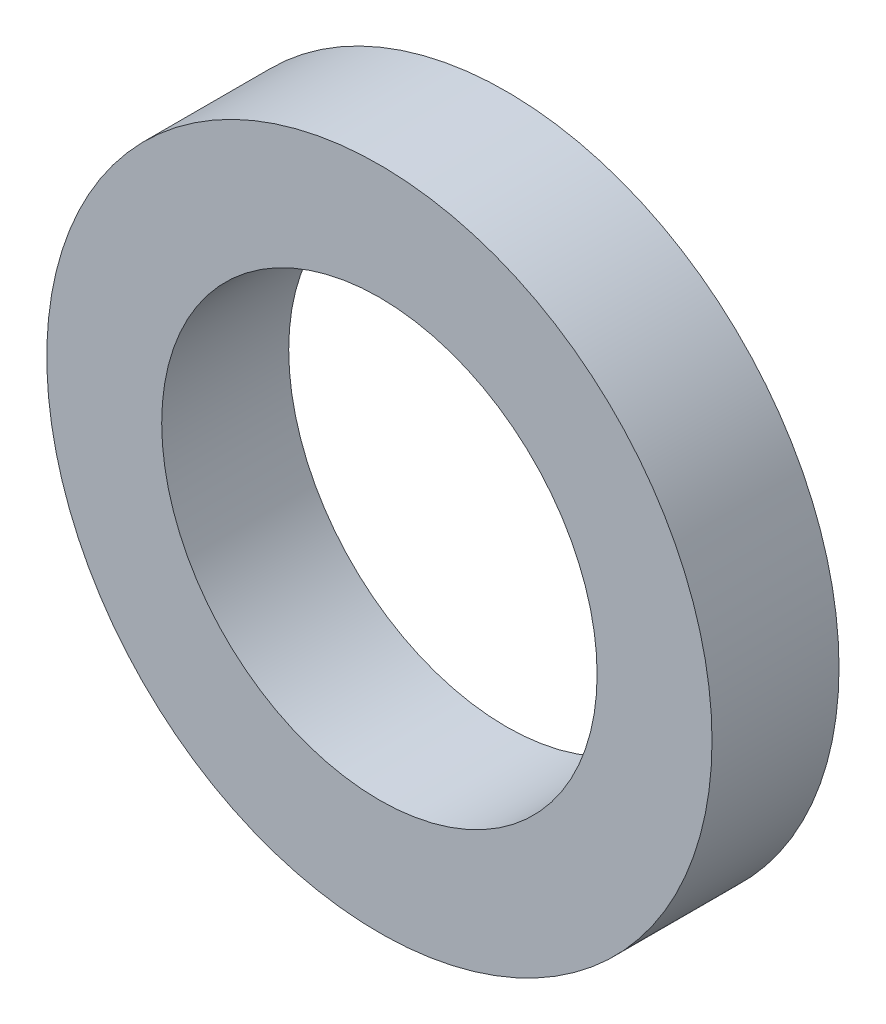
ISO-10303-21;
HEADER;
FILE_DESCRIPTION(('STEP AP214'),'2;1');
FILE_NAME('part.step','',(''),(''),'','','');
FILE_SCHEMA(('AUTOMOTIVE_DESIGN { 1 0 10303 214 1 1 1 1 }'));
ENDSEC;
DATA;
#1=APPLICATION_CONTEXT('core data for automotive mechanical design processes');
#2=APPLICATION_PROTOCOL_DEFINITION('international standard','automotive_design',2000,#1);
#3=PRODUCT_CONTEXT('',#1,'mechanical');
#4=PRODUCT('Part','Part','',(#3));
#5=PRODUCT_RELATED_PRODUCT_CATEGORY('part','',(#4));
#6=PRODUCT_DEFINITION_FORMATION('','',#4);
#7=PRODUCT_DEFINITION_CONTEXT('part definition',#1,'design');
#8=PRODUCT_DEFINITION('design','',#6,#7);
#9=PRODUCT_DEFINITION_SHAPE('','',#8);
#10=(LENGTH_UNIT() NAMED_UNIT(*) SI_UNIT(.MILLI.,.METRE.));
#11=(NAMED_UNIT(*) PLANE_ANGLE_UNIT() SI_UNIT($,.RADIAN.));
#12=(NAMED_UNIT(*) SI_UNIT($,.STERADIAN.) SOLID_ANGLE_UNIT());
#13=UNCERTAINTY_MEASURE_WITH_UNIT(LENGTH_MEASURE(1.E-05),#10,'distance_accuracy_value','');
#14=(GEOMETRIC_REPRESENTATION_CONTEXT(3) GLOBAL_UNCERTAINTY_ASSIGNED_CONTEXT((#13)) GLOBAL_UNIT_ASSIGNED_CONTEXT((#10,
#11,#12)) REPRESENTATION_CONTEXT('',''));
#15=CARTESIAN_POINT('',(0.,0.,0.));
#16=DIRECTION('',(0.,0.,1.));
#17=DIRECTION('',(1.,0.,0.));
#18=AXIS2_PLACEMENT_3D('',#15,#16,#17);
#19=CARTESIAN_POINT('',(0.,0.,2.667));
#20=DIRECTION('',(0.,0.,1.));
#21=DIRECTION('',(1.,0.,0.));
#22=AXIS2_PLACEMENT_3D('',#19,#20,#21);
#23=PLANE('',#22);
#24=CARTESIAN_POINT('',(0.,0.,2.667));
#25=DIRECTION('',(0.,0.,1.));
#26=DIRECTION('',(1.,0.,0.));
#27=AXIS2_PLACEMENT_3D('',#24,#25,#26);
#28=CIRCLE('',#27,13.97);
#29=CARTESIAN_POINT('',(13.97,0.,2.667));
#30=VERTEX_POINT('',#29);
#31=EDGE_CURVE('E10',#30,#30,#28,.T.);
#32=ORIENTED_EDGE('',*,*,#31,.T.);
#33=EDGE_LOOP('',(#32));
#34=FACE_BOUND('',#33,.T.);
#35=CARTESIAN_POINT('',(0.,0.,2.667));
#36=DIRECTION('',(0.,0.,1.));
#37=DIRECTION('',(1.,0.,0.));
#38=AXIS2_PLACEMENT_3D('',#35,#36,#37);
#39=CIRCLE('',#38,9.144);
#40=CARTESIAN_POINT('',(9.144,0.,2.667));
#41=VERTEX_POINT('',#40);
#42=EDGE_CURVE('E42',#41,#41,#39,.T.);
#43=ORIENTED_EDGE('',*,*,#42,.F.);
#44=EDGE_LOOP('',(#43));
#45=FACE_BOUND('',#44,.T.);
#46=ADVANCED_FACE('F31',(#34,#45),#23,.T.);
#47=CARTESIAN_POINT('',(0.,0.,-2.667));
#48=DIRECTION('',(0.,0.,1.));
#49=DIRECTION('',(1.,0.,0.));
#50=AXIS2_PLACEMENT_3D('',#47,#48,#49);
#51=PLANE('',#50);
#52=CARTESIAN_POINT('',(0.,0.,-2.667));
#53=DIRECTION('',(0.,0.,1.));
#54=DIRECTION('',(1.,0.,0.));
#55=AXIS2_PLACEMENT_3D('',#52,#53,#54);
#56=CIRCLE('',#55,13.97);
#57=CARTESIAN_POINT('',(13.97,0.,-2.667));
#58=VERTEX_POINT('',#57);
#59=EDGE_CURVE('E35',#58,#58,#56,.T.);
#60=ORIENTED_EDGE('',*,*,#59,.F.);
#61=EDGE_LOOP('',(#60));
#62=FACE_BOUND('',#61,.T.);
#63=CARTESIAN_POINT('',(0.,0.,-2.667));
#64=DIRECTION('',(0.,0.,1.));
#65=DIRECTION('',(1.,0.,0.));
#66=AXIS2_PLACEMENT_3D('',#63,#64,#65);
#67=CIRCLE('',#66,9.144);
#68=CARTESIAN_POINT('',(9.144,0.,-2.667));
#69=VERTEX_POINT('',#68);
#70=EDGE_CURVE('E44',#69,#69,#67,.T.);
#71=ORIENTED_EDGE('',*,*,#70,.T.);
#72=EDGE_LOOP('',(#71));
#73=FACE_BOUND('',#72,.T.);
#74=ADVANCED_FACE('F54',(#62,#73),#51,.F.);
#75=CARTESIAN_POINT('',(0.,0.,2.667));
#76=DIRECTION('',(0.,0.,-1.));
#77=DIRECTION('',(-1.,0.,0.));
#78=AXIS2_PLACEMENT_3D('',#75,#76,#77);
#79=CYLINDRICAL_SURFACE('',#78,13.97);
#80=ORIENTED_EDGE('',*,*,#31,.F.);
#81=EDGE_LOOP('',(#80));
#82=FACE_BOUND('',#81,.T.);
#83=ORIENTED_EDGE('',*,*,#59,.T.);
#84=EDGE_LOOP('',(#83));
#85=FACE_BOUND('',#84,.T.);
#86=ADVANCED_FACE('F33',(#82,#85),#79,.T.);
#87=CARTESIAN_POINT('',(0.,0.,2.667));
#88=DIRECTION('',(0.,0.,-1.));
#89=DIRECTION('',(-1.,0.,0.));
#90=AXIS2_PLACEMENT_3D('',#87,#88,#89);
#91=CYLINDRICAL_SURFACE('',#90,9.144);
#92=ORIENTED_EDGE('',*,*,#42,.T.);
#93=EDGE_LOOP('',(#92));
#94=FACE_BOUND('',#93,.T.);
#95=ORIENTED_EDGE('',*,*,#70,.F.);
#96=EDGE_LOOP('',(#95));
#97=FACE_BOUND('',#96,.T.);
#98=ADVANCED_FACE('F50',(#94,#97),#91,.F.);
#99=CLOSED_SHELL('',(#46,#74,#86,#98));
#100=MANIFOLD_SOLID_BREP('B2',#99);
#101=ADVANCED_BREP_SHAPE_REPRESENTATION('',(#18,#100),#14);
#102=SHAPE_DEFINITION_REPRESENTATION(#9,#101);
ENDSEC;
END-ISO-10303-21;
